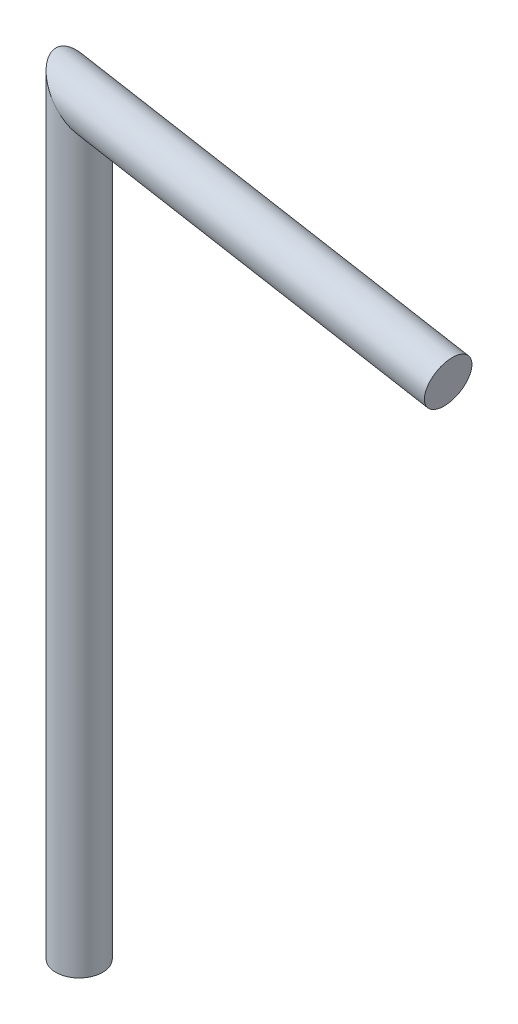
ISO-10303-21;
HEADER;
FILE_DESCRIPTION(('STEP AP214'),'2;1');
FILE_NAME('part.step','',(''),(''),'','','');
FILE_SCHEMA(('AUTOMOTIVE_DESIGN { 1 0 10303 214 1 1 1 1 }'));
ENDSEC;
DATA;
#1=APPLICATION_CONTEXT('core data for automotive mechanical design processes');
#2=APPLICATION_PROTOCOL_DEFINITION('international standard','automotive_design',2000,#1);
#3=PRODUCT_CONTEXT('',#1,'mechanical');
#4=PRODUCT('Part','Part','',(#3));
#5=PRODUCT_RELATED_PRODUCT_CATEGORY('part','',(#4));
#6=PRODUCT_DEFINITION_FORMATION('','',#4);
#7=PRODUCT_DEFINITION_CONTEXT('part definition',#1,'design');
#8=PRODUCT_DEFINITION('design','',#6,#7);
#9=PRODUCT_DEFINITION_SHAPE('','',#8);
#10=(LENGTH_UNIT() NAMED_UNIT(*) SI_UNIT(.MILLI.,.METRE.));
#11=(NAMED_UNIT(*) PLANE_ANGLE_UNIT() SI_UNIT($,.RADIAN.));
#12=(NAMED_UNIT(*) SI_UNIT($,.STERADIAN.) SOLID_ANGLE_UNIT());
#13=UNCERTAINTY_MEASURE_WITH_UNIT(LENGTH_MEASURE(1.E-05),#10,'distance_accuracy_value','');
#14=(GEOMETRIC_REPRESENTATION_CONTEXT(3) GLOBAL_UNCERTAINTY_ASSIGNED_CONTEXT((#13)) GLOBAL_UNIT_ASSIGNED_CONTEXT((#10,
#11,#12)) REPRESENTATION_CONTEXT('',''));
#15=CARTESIAN_POINT('',(0.,0.,0.));
#16=DIRECTION('',(0.,0.,1.));
#17=DIRECTION('',(1.,0.,0.));
#18=AXIS2_PLACEMENT_3D('',#15,#16,#17);
#19=CARTESIAN_POINT('',(39.3923101204883,73.0540728933226,0.));
#20=DIRECTION('',(0.984807753012207,-0.173648177666934,0.));
#21=DIRECTION('',(0.,0.,1.));
#22=AXIS2_PLACEMENT_3D('',#19,#20,#21);
#23=PLANE('',#22);
#24=CARTESIAN_POINT('',(39.3923101204883,73.0540728933226,0.));
#25=DIRECTION('',(0.984807753012207,-0.173648177666934,0.));
#26=DIRECTION('',(0.,0.,1.));
#27=AXIS2_PLACEMENT_3D('',#24,#25,#26);
#28=CIRCLE('',#27,2.5);
#29=CARTESIAN_POINT('',(39.3923101204883,73.0540728933226,2.5));
#30=VERTEX_POINT('',#29);
#31=EDGE_CURVE('E42',#30,#30,#28,.T.);
#32=ORIENTED_EDGE('',*,*,#31,.T.);
#33=EDGE_LOOP('',(#32));
#34=FACE_BOUND('',#33,.T.);
#35=ADVANCED_FACE('F39',(#34),#23,.T.);
#36=CARTESIAN_POINT('',(0.,0.,0.));
#37=DIRECTION('',(0.,1.,0.));
#38=DIRECTION('',(0.,0.,1.));
#39=AXIS2_PLACEMENT_3D('',#36,#37,#38);
#40=PLANE('',#39);
#41=CARTESIAN_POINT('',(0.,0.,0.));
#42=DIRECTION('',(0.,1.,0.));
#43=DIRECTION('',(0.,0.,1.));
#44=AXIS2_PLACEMENT_3D('',#41,#42,#43);
#45=CIRCLE('',#44,2.5);
#46=CARTESIAN_POINT('',(0.,0.,2.5));
#47=VERTEX_POINT('',#46);
#48=EDGE_CURVE('E48',#47,#47,#45,.T.);
#49=ORIENTED_EDGE('',*,*,#48,.F.);
#50=EDGE_LOOP('',(#49));
#51=FACE_BOUND('',#50,.T.);
#52=ADVANCED_FACE('F70',(#51),#40,.F.);
#53=CARTESIAN_POINT('',(-6.55354575246936,81.1555669354677,0.));
#54=DIRECTION('',(0.984807753012207,-0.173648177666934,0.));
#55=DIRECTION('',(0.173648177666934,0.984807753012207,0.));
#56=AXIS2_PLACEMENT_3D('',#53,#54,#55);
#57=CYLINDRICAL_SURFACE('',#56,2.5);
#58=CARTESIAN_POINT('',(0.,80.,0.));
#59=DIRECTION('',(0.766044443118979,0.642787609686538,0.));
#60=DIRECTION('',(-0.642787609686538,0.766044443118979,0.));
#61=AXIS2_PLACEMENT_3D('',#58,#59,#60);
#62=ELLIPSE('',#61,3.88930956715104,2.5);
#63=CARTESIAN_POINT('',(-2.5,82.9793839814855,0.));
#64=VERTEX_POINT('',#63);
#65=EDGE_CURVE('E11',#64,#64,#62,.F.);
#66=ORIENTED_EDGE('',*,*,#65,.F.);
#67=EDGE_LOOP('',(#66));
#68=FACE_BOUND('',#67,.T.);
#69=ORIENTED_EDGE('',*,*,#31,.F.);
#70=EDGE_LOOP('',(#69));
#71=FACE_BOUND('',#70,.T.);
#72=ADVANCED_FACE('F60',(#68,#71),#57,.T.);
#73=CARTESIAN_POINT('',(0.,0.,0.));
#74=DIRECTION('',(0.,1.,0.));
#75=DIRECTION('',(0.,0.,1.));
#76=AXIS2_PLACEMENT_3D('',#73,#74,#75);
#77=CYLINDRICAL_SURFACE('',#76,2.5);
#78=ORIENTED_EDGE('',*,*,#48,.T.);
#79=EDGE_LOOP('',(#78));
#80=FACE_BOUND('',#79,.T.);
#81=ORIENTED_EDGE('',*,*,#65,.T.);
#82=EDGE_LOOP('',(#81));
#83=FACE_BOUND('',#82,.T.);
#84=ADVANCED_FACE('F63',(#80,#83),#77,.T.);
#85=CLOSED_SHELL('',(#35,#52,#72,#84));
#86=MANIFOLD_SOLID_BREP('B2',#85);
#87=ADVANCED_BREP_SHAPE_REPRESENTATION('',(#18,#86),#14);
#88=SHAPE_DEFINITION_REPRESENTATION(#9,#87);
ENDSEC;
END-ISO-10303-21;
